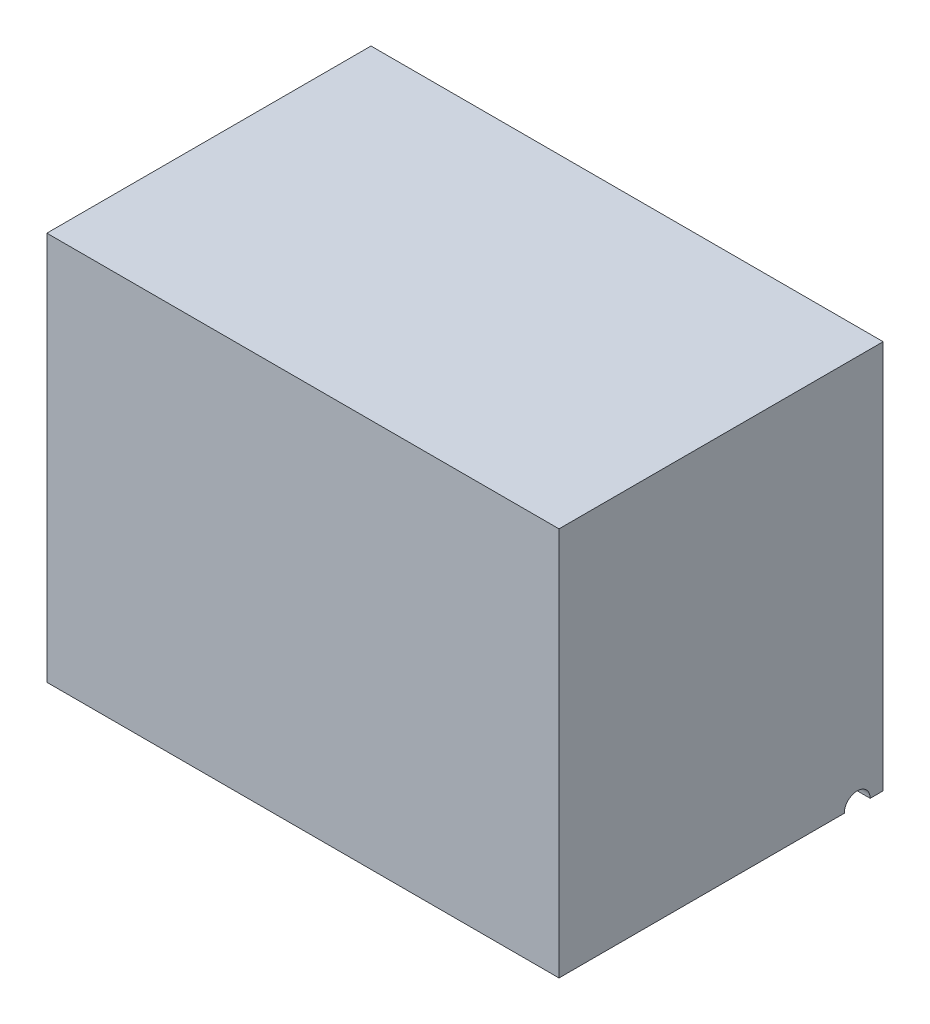
ISO-10303-21;
HEADER;
FILE_DESCRIPTION(('STEP AP214'),'2;1');
FILE_NAME('part.step','',(''),(''),'','','');
FILE_SCHEMA(('AUTOMOTIVE_DESIGN { 1 0 10303 214 1 1 1 1 }'));
ENDSEC;
DATA;
#1=APPLICATION_CONTEXT('core data for automotive mechanical design processes');
#2=APPLICATION_PROTOCOL_DEFINITION('international standard','automotive_design',2000,#1);
#3=PRODUCT_CONTEXT('',#1,'mechanical');
#4=PRODUCT('Part','Part','',(#3));
#5=PRODUCT_RELATED_PRODUCT_CATEGORY('part','',(#4));
#6=PRODUCT_DEFINITION_FORMATION('','',#4);
#7=PRODUCT_DEFINITION_CONTEXT('part definition',#1,'design');
#8=PRODUCT_DEFINITION('design','',#6,#7);
#9=PRODUCT_DEFINITION_SHAPE('','',#8);
#10=(LENGTH_UNIT() NAMED_UNIT(*) SI_UNIT(.MILLI.,.METRE.));
#11=(NAMED_UNIT(*) PLANE_ANGLE_UNIT() SI_UNIT($,.RADIAN.));
#12=(NAMED_UNIT(*) SI_UNIT($,.STERADIAN.) SOLID_ANGLE_UNIT());
#13=UNCERTAINTY_MEASURE_WITH_UNIT(LENGTH_MEASURE(1.E-05),#10,'distance_accuracy_value','');
#14=(GEOMETRIC_REPRESENTATION_CONTEXT(3) GLOBAL_UNCERTAINTY_ASSIGNED_CONTEXT((#13)) GLOBAL_UNIT_ASSIGNED_CONTEXT((#10,
#11,#12)) REPRESENTATION_CONTEXT('',''));
#15=CARTESIAN_POINT('',(0.,0.,0.));
#16=DIRECTION('',(0.,0.,1.));
#17=DIRECTION('',(1.,0.,0.));
#18=AXIS2_PLACEMENT_3D('',#15,#16,#17);
#19=CARTESIAN_POINT('',(0.,39.8959813156576,0.));
#20=DIRECTION('',(0.,-1.,0.));
#21=DIRECTION('',(0.,0.,-1.));
#22=AXIS2_PLACEMENT_3D('',#19,#20,#21);
#23=PLANE('',#22);
#24=DIRECTION('',(1.,0.,0.));
#25=VECTOR('',#24,1.);
#26=CARTESIAN_POINT('',(149.,39.8959813156576,103.442125645559));
#27=LINE('',#26,#25);
#28=CARTESIAN_POINT('',(149.,39.8959813156576,103.442125645559));
#29=VERTEX_POINT('',#28);
#30=CARTESIAN_POINT('',(188.5,39.8959813156576,103.442125645559));
#31=VERTEX_POINT('',#30);
#32=EDGE_CURVE('E98',#29,#31,#27,.T.);
#33=ORIENTED_EDGE('',*,*,#32,.T.);
#34=DIRECTION('',(0.,0.,1.));
#35=VECTOR('',#34,1.);
#36=CARTESIAN_POINT('',(188.5,39.8959813156576,0.));
#37=LINE('',#36,#35);
#38=CARTESIAN_POINT('',(188.5,39.8959813156576,104.442125645559));
#39=VERTEX_POINT('',#38);
#40=EDGE_CURVE('E56',#31,#39,#37,.T.);
#41=ORIENTED_EDGE('',*,*,#40,.T.);
#42=DIRECTION('',(1.,0.,0.));
#43=VECTOR('',#42,1.);
#44=CARTESIAN_POINT('',(146.171572875254,39.8959813156576,104.442125645559));
#45=LINE('',#44,#43);
#46=CARTESIAN_POINT('',(149.,39.8959813156576,104.442125645559));
#47=VERTEX_POINT('',#46);
#48=EDGE_CURVE('E107',#47,#39,#45,.T.);
#49=ORIENTED_EDGE('',*,*,#48,.F.);
#50=DIRECTION('',(0.,0.,-1.));
#51=VECTOR('',#50,1.);
#52=CARTESIAN_POINT('',(149.,39.8959813156576,128.442125645559));
#53=LINE('',#52,#51);
#54=EDGE_CURVE('E116',#47,#29,#53,.T.);
#55=ORIENTED_EDGE('',*,*,#54,.T.);
#56=EDGE_LOOP('',(#33,#41,#49,#55));
#57=FACE_BOUND('',#56,.T.);
#58=ADVANCED_FACE('F38',(#57),#23,.T.);
#59=CARTESIAN_POINT('',(149.,39.8959813156576,103.442125645559));
#60=DIRECTION('',(0.,0.,1.));
#61=DIRECTION('',(1.,0.,0.));
#62=AXIS2_PLACEMENT_3D('',#59,#60,#61);
#63=PLANE('',#62);
#64=DIRECTION('',(0.,1.,0.));
#65=VECTOR('',#64,1.);
#66=CARTESIAN_POINT('',(188.5,39.8959813156576,103.442125645559));
#67=LINE('',#66,#65);
#68=CARTESIAN_POINT('',(188.5,69.8959813156576,103.442125645559));
#69=VERTEX_POINT('',#68);
#70=EDGE_CURVE('E74',#31,#69,#67,.T.);
#71=ORIENTED_EDGE('',*,*,#70,.F.);
#72=ORIENTED_EDGE('',*,*,#32,.F.);
#73=DIRECTION('',(0.,1.,0.));
#74=VECTOR('',#73,1.);
#75=CARTESIAN_POINT('',(149.,39.8959813156576,103.442125645559));
#76=LINE('',#75,#74);
#77=CARTESIAN_POINT('',(149.,69.8959813156576,103.442125645559));
#78=VERTEX_POINT('',#77);
#79=EDGE_CURVE('E119',#29,#78,#76,.T.);
#80=ORIENTED_EDGE('',*,*,#79,.T.);
#81=DIRECTION('',(1.,0.,0.));
#82=VECTOR('',#81,1.);
#83=CARTESIAN_POINT('',(149.,69.8959813156576,103.442125645559));
#84=LINE('',#83,#82);
#85=EDGE_CURVE('E42',#78,#69,#84,.T.);
#86=ORIENTED_EDGE('',*,*,#85,.T.);
#87=EDGE_LOOP('',(#71,#72,#80,#86));
#88=FACE_BOUND('',#87,.T.);
#89=ADVANCED_FACE('F40',(#88),#63,.F.);
#90=CARTESIAN_POINT('',(149.,39.8959813156576,128.442125645559));
#91=DIRECTION('',(0.,0.,-1.));
#92=DIRECTION('',(-1.,0.,0.));
#93=AXIS2_PLACEMENT_3D('',#90,#91,#92);
#94=PLANE('',#93);
#95=DIRECTION('',(0.,1.,0.));
#96=VECTOR('',#95,1.);
#97=CARTESIAN_POINT('',(188.5,0.,128.442125645559));
#98=LINE('',#97,#96);
#99=CARTESIAN_POINT('',(188.5,39.8959813156576,128.442125645559));
#100=VERTEX_POINT('',#99);
#101=CARTESIAN_POINT('',(188.5,69.8959813156576,128.442125645559));
#102=VERTEX_POINT('',#101);
#103=EDGE_CURVE('E69',#100,#102,#98,.T.);
#104=ORIENTED_EDGE('',*,*,#103,.T.);
#105=DIRECTION('',(-1.,0.,0.));
#106=VECTOR('',#105,1.);
#107=CARTESIAN_POINT('',(149.,69.8959813156576,128.442125645559));
#108=LINE('',#107,#106);
#109=CARTESIAN_POINT('',(149.,69.8959813156576,128.442125645559));
#110=VERTEX_POINT('',#109);
#111=EDGE_CURVE('E86',#102,#110,#108,.T.);
#112=ORIENTED_EDGE('',*,*,#111,.T.);
#113=DIRECTION('',(0.,1.,0.));
#114=VECTOR('',#113,1.);
#115=CARTESIAN_POINT('',(149.,39.8959813156576,128.442125645559));
#116=LINE('',#115,#114);
#117=CARTESIAN_POINT('',(149.,39.8959813156576,128.442125645559));
#118=VERTEX_POINT('',#117);
#119=EDGE_CURVE('E109',#118,#110,#116,.T.);
#120=ORIENTED_EDGE('',*,*,#119,.F.);
#121=DIRECTION('',(-1.,0.,0.));
#122=VECTOR('',#121,1.);
#123=CARTESIAN_POINT('',(149.,39.8959813156576,128.442125645559));
#124=LINE('',#123,#122);
#125=EDGE_CURVE('E89',#100,#118,#124,.T.);
#126=ORIENTED_EDGE('',*,*,#125,.F.);
#127=EDGE_LOOP('',(#104,#112,#120,#126));
#128=FACE_BOUND('',#127,.T.);
#129=ADVANCED_FACE('F83',(#128),#94,.F.);
#130=DIRECTION('',(1.,0.,0.));
#131=VECTOR('',#130,1.);
#132=CARTESIAN_POINT('',(146.171572875254,39.8959813156576,106.442125645559));
#133=LINE('',#132,#131);
#134=CARTESIAN_POINT('',(188.5,39.8959813156576,106.442125645559));
#135=VERTEX_POINT('',#134);
#136=CARTESIAN_POINT('',(149.,39.8959813156576,106.442125645559));
#137=VERTEX_POINT('',#136);
#138=EDGE_CURVE('E103',#135,#137,#133,.F.);
#139=ORIENTED_EDGE('',*,*,#138,.F.);
#140=EDGE_CURVE('E95',#135,#100,#37,.T.);
#141=ORIENTED_EDGE('',*,*,#140,.T.);
#142=ORIENTED_EDGE('',*,*,#125,.T.);
#143=EDGE_CURVE('E102',#118,#137,#53,.T.);
#144=ORIENTED_EDGE('',*,*,#143,.T.);
#145=EDGE_LOOP('',(#139,#141,#142,#144));
#146=FACE_BOUND('',#145,.T.);
#147=ADVANCED_FACE('F142',(#146),#23,.T.);
#148=CARTESIAN_POINT('',(0.,69.8959813156576,0.));
#149=DIRECTION('',(0.,-1.,0.));
#150=DIRECTION('',(0.,0.,-1.));
#151=AXIS2_PLACEMENT_3D('',#148,#149,#150);
#152=PLANE('',#151);
#153=DIRECTION('',(0.,0.,1.));
#154=VECTOR('',#153,1.);
#155=CARTESIAN_POINT('',(188.5,69.8959813156576,0.));
#156=LINE('',#155,#154);
#157=EDGE_CURVE('E48',#69,#102,#156,.T.);
#158=ORIENTED_EDGE('',*,*,#157,.F.);
#159=ORIENTED_EDGE('',*,*,#85,.F.);
#160=DIRECTION('',(0.,0.,-1.));
#161=VECTOR('',#160,1.);
#162=CARTESIAN_POINT('',(149.,69.8959813156576,128.442125645559));
#163=LINE('',#162,#161);
#164=EDGE_CURVE('E94',#110,#78,#163,.T.);
#165=ORIENTED_EDGE('',*,*,#164,.F.);
#166=ORIENTED_EDGE('',*,*,#111,.F.);
#167=EDGE_LOOP('',(#158,#159,#165,#166));
#168=FACE_BOUND('',#167,.T.);
#169=ADVANCED_FACE('F92',(#168),#152,.F.);
#170=CARTESIAN_POINT('',(146.171572875254,39.8959813156576,105.442125645559));
#171=DIRECTION('',(1.,0.,0.));
#172=DIRECTION('',(0.,0.,-1.));
#173=AXIS2_PLACEMENT_3D('',#170,#171,#172);
#174=CYLINDRICAL_SURFACE('',#173,0.999999999999998);
#175=CARTESIAN_POINT('',(188.5,39.8959813156576,105.442125645559));
#176=DIRECTION('',(1.,0.,0.));
#177=DIRECTION('',(0.,0.,-1.));
#178=AXIS2_PLACEMENT_3D('',#175,#176,#177);
#179=CIRCLE('',#178,0.999999999999998);
#180=EDGE_CURVE('E11',#135,#39,#179,.F.);
#181=ORIENTED_EDGE('',*,*,#180,.F.);
#182=ORIENTED_EDGE('',*,*,#138,.T.);
#183=CARTESIAN_POINT('',(149.,39.8959813156576,105.442125645559));
#184=DIRECTION('',(1.,0.,0.));
#185=DIRECTION('',(0.,0.,-1.));
#186=AXIS2_PLACEMENT_3D('',#183,#184,#185);
#187=CIRCLE('',#186,0.999999999999998);
#188=EDGE_CURVE('E106',#137,#47,#187,.F.);
#189=ORIENTED_EDGE('',*,*,#188,.T.);
#190=ORIENTED_EDGE('',*,*,#48,.T.);
#191=EDGE_LOOP('',(#181,#182,#189,#190));
#192=FACE_BOUND('',#191,.T.);
#193=ADVANCED_FACE('F132',(#192),#174,.F.);
#194=CARTESIAN_POINT('',(149.,39.8959813156576,128.442125645559));
#195=DIRECTION('',(1.,0.,0.));
#196=DIRECTION('',(0.,0.,-1.));
#197=AXIS2_PLACEMENT_3D('',#194,#195,#196);
#198=PLANE('',#197);
#199=ORIENTED_EDGE('',*,*,#54,.F.);
#200=ORIENTED_EDGE('',*,*,#188,.F.);
#201=ORIENTED_EDGE('',*,*,#143,.F.);
#202=ORIENTED_EDGE('',*,*,#119,.T.);
#203=ORIENTED_EDGE('',*,*,#164,.T.);
#204=ORIENTED_EDGE('',*,*,#79,.F.);
#205=EDGE_LOOP('',(#199,#200,#201,#202,#203,#204));
#206=FACE_BOUND('',#205,.T.);
#207=ADVANCED_FACE('F138',(#206),#198,.F.);
#208=CARTESIAN_POINT('',(188.5,0.,0.));
#209=DIRECTION('',(1.,0.,0.));
#210=DIRECTION('',(0.,0.,-1.));
#211=AXIS2_PLACEMENT_3D('',#208,#209,#210);
#212=PLANE('',#211);
#213=ORIENTED_EDGE('',*,*,#70,.T.);
#214=ORIENTED_EDGE('',*,*,#157,.T.);
#215=ORIENTED_EDGE('',*,*,#103,.F.);
#216=ORIENTED_EDGE('',*,*,#140,.F.);
#217=ORIENTED_EDGE('',*,*,#180,.T.);
#218=ORIENTED_EDGE('',*,*,#40,.F.);
#219=EDGE_LOOP('',(#213,#214,#215,#216,#217,#218));
#220=FACE_BOUND('',#219,.T.);
#221=ADVANCED_FACE('F73',(#220),#212,.T.);
#222=CLOSED_SHELL('',(#58,#89,#129,#147,#169,#193,#207,#221));
#223=MANIFOLD_SOLID_BREP('B2',#222);
#224=ADVANCED_BREP_SHAPE_REPRESENTATION('',(#18,#223),#14);
#225=SHAPE_DEFINITION_REPRESENTATION(#9,#224);
ENDSEC;
END-ISO-10303-21;
